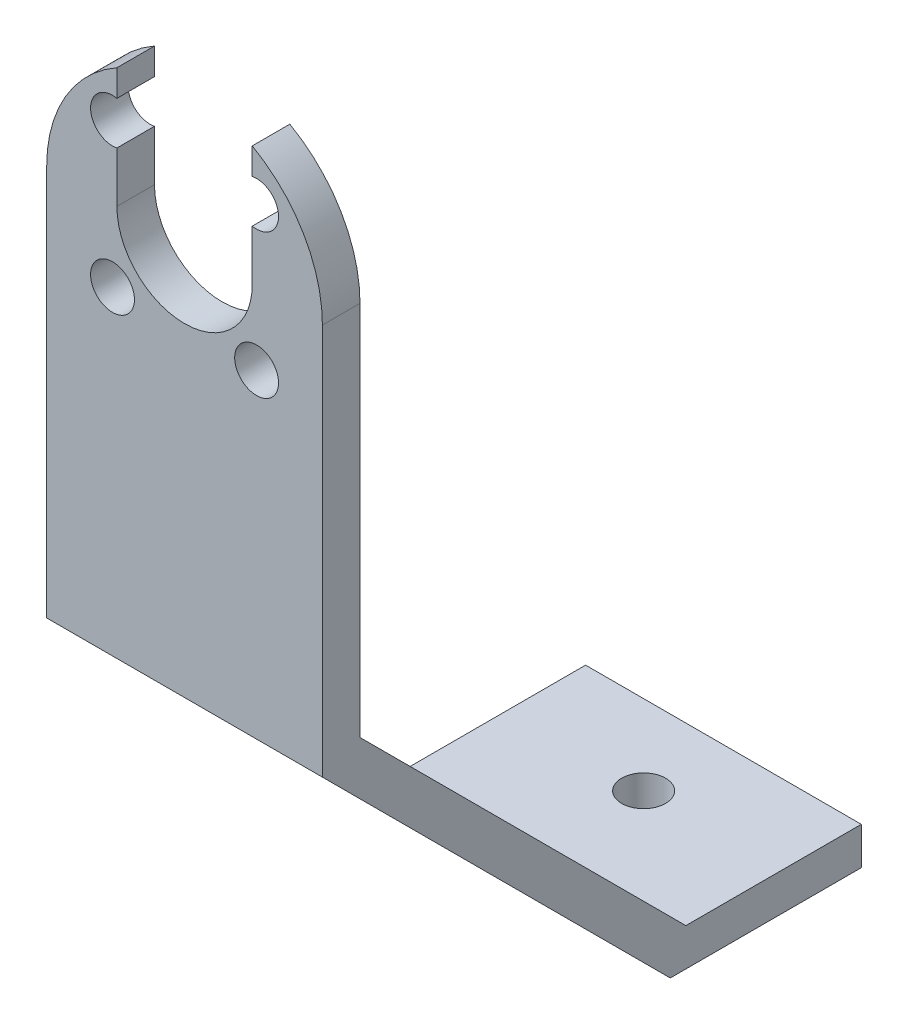
ISO-10303-21;
HEADER;
FILE_DESCRIPTION(('STEP AP214'),'2;1');
FILE_NAME('part.step','',(''),(''),'','','');
FILE_SCHEMA(('AUTOMOTIVE_DESIGN { 1 0 10303 214 1 1 1 1 }'));
ENDSEC;
DATA;
#1=APPLICATION_CONTEXT('core data for automotive mechanical design processes');
#2=APPLICATION_PROTOCOL_DEFINITION('international standard','automotive_design',2000,#1);
#3=PRODUCT_CONTEXT('',#1,'mechanical');
#4=PRODUCT('Part','Part','',(#3));
#5=PRODUCT_RELATED_PRODUCT_CATEGORY('part','',(#4));
#6=PRODUCT_DEFINITION_FORMATION('','',#4);
#7=PRODUCT_DEFINITION_CONTEXT('part definition',#1,'design');
#8=PRODUCT_DEFINITION('design','',#6,#7);
#9=PRODUCT_DEFINITION_SHAPE('','',#8);
#10=(LENGTH_UNIT() NAMED_UNIT(*) SI_UNIT(.MILLI.,.METRE.));
#11=(NAMED_UNIT(*) PLANE_ANGLE_UNIT() SI_UNIT($,.RADIAN.));
#12=(NAMED_UNIT(*) SI_UNIT($,.STERADIAN.) SOLID_ANGLE_UNIT());
#13=UNCERTAINTY_MEASURE_WITH_UNIT(LENGTH_MEASURE(1.E-05),#10,'distance_accuracy_value','');
#14=(GEOMETRIC_REPRESENTATION_CONTEXT(3) GLOBAL_UNCERTAINTY_ASSIGNED_CONTEXT((#13)) GLOBAL_UNIT_ASSIGNED_CONTEXT((#10,
#11,#12)) REPRESENTATION_CONTEXT('',''));
#15=CARTESIAN_POINT('',(0.,0.,0.));
#16=DIRECTION('',(0.,0.,1.));
#17=DIRECTION('',(1.,0.,0.));
#18=AXIS2_PLACEMENT_3D('',#15,#16,#17);
#19=CARTESIAN_POINT('',(0.,0.,0.));
#20=DIRECTION('',(0.,0.,1.));
#21=DIRECTION('',(1.,0.,0.));
#22=AXIS2_PLACEMENT_3D('',#19,#20,#21);
#23=PLANE('',#22);
#24=CARTESIAN_POINT('',(-5.75000000000002,-5.74999999999991,0.));
#25=DIRECTION('',(0.,0.,1.));
#26=DIRECTION('',(1.,0.,0.));
#27=AXIS2_PLACEMENT_3D('',#24,#25,#26);
#28=CIRCLE('',#27,1.75);
#29=CARTESIAN_POINT('',(-4.00000000000002,-5.74999999999991,0.));
#30=VERTEX_POINT('',#29);
#31=EDGE_CURVE('E229',#30,#30,#28,.T.);
#32=ORIENTED_EDGE('',*,*,#31,.T.);
#33=EDGE_LOOP('',(#32));
#34=FACE_BOUND('',#33,.T.);
#35=CARTESIAN_POINT('',(5.74999999999998,-5.74999999999996,0.));
#36=DIRECTION('',(0.,0.,1.));
#37=DIRECTION('',(1.,0.,0.));
#38=AXIS2_PLACEMENT_3D('',#35,#36,#37);
#39=CIRCLE('',#38,1.75);
#40=CARTESIAN_POINT('',(7.49999999999998,-5.74999999999996,0.));
#41=VERTEX_POINT('',#40);
#42=EDGE_CURVE('E187',#41,#41,#39,.T.);
#43=ORIENTED_EDGE('',*,*,#42,.T.);
#44=EDGE_LOOP('',(#43));
#45=FACE_BOUND('',#44,.T.);
#46=DIRECTION('',(0.,1.,0.));
#47=VECTOR('',#46,1.);
#48=CARTESIAN_POINT('',(11.,-58.9999999999999,0.));
#49=LINE('',#48,#47);
#50=CARTESIAN_POINT('',(11.,-30.,0.));
#51=VERTEX_POINT('',#50);
#52=CARTESIAN_POINT('',(11.,0.,0.));
#53=VERTEX_POINT('',#52);
#54=EDGE_CURVE('E173',#51,#53,#49,.T.);
#55=ORIENTED_EDGE('',*,*,#54,.F.);
#56=DIRECTION('',(1.,0.,0.));
#57=VECTOR('',#56,1.);
#58=CARTESIAN_POINT('',(-11.,-30.,0.));
#59=LINE('',#58,#57);
#60=CARTESIAN_POINT('',(-11.,-30.,0.));
#61=VERTEX_POINT('',#60);
#62=EDGE_CURVE('E291',#61,#51,#59,.T.);
#63=ORIENTED_EDGE('',*,*,#62,.F.);
#64=DIRECTION('',(0.,1.,0.));
#65=VECTOR('',#64,1.);
#66=CARTESIAN_POINT('',(-11.,-58.9999999999999,0.));
#67=LINE('',#66,#65);
#68=CARTESIAN_POINT('',(-11.,0.,0.));
#69=VERTEX_POINT('',#68);
#70=EDGE_CURVE('E180',#61,#69,#67,.T.);
#71=ORIENTED_EDGE('',*,*,#70,.T.);
#72=CARTESIAN_POINT('',(0.,0.,0.));
#73=DIRECTION('',(0.,0.,1.));
#74=DIRECTION('',(1.,0.,0.));
#75=AXIS2_PLACEMENT_3D('',#72,#73,#74);
#76=CIRCLE('',#75,11.);
#77=CARTESIAN_POINT('',(-5.4,9.58331884056875,0.));
#78=VERTEX_POINT('',#77);
#79=EDGE_CURVE('E225',#78,#69,#76,.T.);
#80=ORIENTED_EDGE('',*,*,#79,.F.);
#81=DIRECTION('',(0.,1.,0.));
#82=VECTOR('',#81,1.);
#83=CARTESIAN_POINT('',(-5.4,0.,0.));
#84=LINE('',#83,#82);
#85=CARTESIAN_POINT('',(-5.4,7.46464281994815,0.));
#86=VERTEX_POINT('',#85);
#87=EDGE_CURVE('E222',#86,#78,#84,.T.);
#88=ORIENTED_EDGE('',*,*,#87,.F.);
#89=CARTESIAN_POINT('',(-5.74999999999991,5.74999999999991,0.));
#90=DIRECTION('',(0.,0.,1.));
#91=DIRECTION('',(1.,0.,0.));
#92=AXIS2_PLACEMENT_3D('',#89,#90,#91);
#93=CIRCLE('',#92,1.75);
#94=CARTESIAN_POINT('',(-5.4,4.03535718005167,0.));
#95=VERTEX_POINT('',#94);
#96=EDGE_CURVE('E221',#86,#95,#93,.T.);
#97=ORIENTED_EDGE('',*,*,#96,.T.);
#98=CARTESIAN_POINT('',(-5.4,0.,0.));
#99=VERTEX_POINT('',#98);
#100=EDGE_CURVE('E218',#99,#95,#84,.T.);
#101=ORIENTED_EDGE('',*,*,#100,.F.);
#102=CARTESIAN_POINT('',(0.,0.,0.));
#103=DIRECTION('',(0.,0.,1.));
#104=DIRECTION('',(1.,0.,0.));
#105=AXIS2_PLACEMENT_3D('',#102,#103,#104);
#106=CIRCLE('',#105,5.4);
#107=CARTESIAN_POINT('',(5.4,0.,0.));
#108=VERTEX_POINT('',#107);
#109=EDGE_CURVE('E214',#99,#108,#106,.T.);
#110=ORIENTED_EDGE('',*,*,#109,.T.);
#111=DIRECTION('',(0.,1.,0.));
#112=VECTOR('',#111,1.);
#113=CARTESIAN_POINT('',(5.4,0.,0.));
#114=LINE('',#113,#112);
#115=CARTESIAN_POINT('',(5.4,4.03535718005169,0.));
#116=VERTEX_POINT('',#115);
#117=EDGE_CURVE('E211',#108,#116,#114,.T.);
#118=ORIENTED_EDGE('',*,*,#117,.T.);
#119=CARTESIAN_POINT('',(5.75000000000002,5.74999999999991,0.));
#120=DIRECTION('',(0.,0.,1.));
#121=DIRECTION('',(1.,0.,0.));
#122=AXIS2_PLACEMENT_3D('',#119,#120,#121);
#123=CIRCLE('',#122,1.75);
#124=CARTESIAN_POINT('',(5.4,7.46464281994813,0.));
#125=VERTEX_POINT('',#124);
#126=EDGE_CURVE('E182',#116,#125,#123,.T.);
#127=ORIENTED_EDGE('',*,*,#126,.T.);
#128=CARTESIAN_POINT('',(5.4,9.58331884056875,0.));
#129=VERTEX_POINT('',#128);
#130=EDGE_CURVE('E215',#125,#129,#114,.T.);
#131=ORIENTED_EDGE('',*,*,#130,.T.);
#132=EDGE_CURVE('E228',#53,#129,#76,.T.);
#133=ORIENTED_EDGE('',*,*,#132,.F.);
#134=EDGE_LOOP('',(#55,#63,#71,#80,#88,#97,#101,#110,#118,#127,#131,#133));
#135=FACE_BOUND('',#134,.T.);
#136=ADVANCED_FACE('F35',(#34,#45,#135),#23,.F.);
#137=CARTESIAN_POINT('',(51.1123422402632,-55.9999999999999,0.));
#138=DIRECTION('',(0.,1.,0.));
#139=DIRECTION('',(0.,0.,1.));
#140=AXIS2_PLACEMENT_3D('',#137,#138,#139);
#141=PLANE('',#140);
#142=DIRECTION('',(1.,0.,0.));
#143=VECTOR('',#142,1.);
#144=CARTESIAN_POINT('',(-11.,-55.9999999999999,-26.));
#145=LINE('',#144,#143);
#146=CARTESIAN_POINT('',(-11.,-55.9999999999999,-26.));
#147=VERTEX_POINT('',#146);
#148=CARTESIAN_POINT('',(11.,-55.9999999999999,-26.));
#149=VERTEX_POINT('',#148);
#150=EDGE_CURVE('E317',#147,#149,#145,.T.);
#151=ORIENTED_EDGE('',*,*,#150,.T.);
#152=DIRECTION('',(0.,0.,1.));
#153=VECTOR('',#152,1.);
#154=CARTESIAN_POINT('',(11.,-55.9999999999999,0.));
#155=LINE('',#154,#153);
#156=CARTESIAN_POINT('',(11.,-55.9999999999999,-40.));
#157=VERTEX_POINT('',#156);
#158=EDGE_CURVE('E296',#157,#149,#155,.T.);
#159=ORIENTED_EDGE('',*,*,#158,.F.);
#160=DIRECTION('',(-1.,0.,0.));
#161=VECTOR('',#160,1.);
#162=CARTESIAN_POINT('',(51.1123422402632,-55.9999999999999,-40.));
#163=LINE('',#162,#161);
#164=CARTESIAN_POINT('',(-11.,-55.9999999999999,-40.));
#165=VERTEX_POINT('',#164);
#166=EDGE_CURVE('E301',#157,#165,#163,.T.);
#167=ORIENTED_EDGE('',*,*,#166,.T.);
#168=DIRECTION('',(0.,0.,-1.));
#169=VECTOR('',#168,1.);
#170=CARTESIAN_POINT('',(-11.,-55.9999999999999,0.));
#171=LINE('',#170,#169);
#172=EDGE_CURVE('E310',#147,#165,#171,.T.);
#173=ORIENTED_EDGE('',*,*,#172,.F.);
#174=EDGE_LOOP('',(#151,#159,#167,#173));
#175=FACE_BOUND('',#174,.T.);
#176=CARTESIAN_POINT('',(0.,-55.9999999999999,-33.63));
#177=DIRECTION('',(0.,1.,0.));
#178=DIRECTION('',(0.,0.,1.));
#179=AXIS2_PLACEMENT_3D('',#176,#177,#178);
#180=CIRCLE('',#179,1.75);
#181=CARTESIAN_POINT('',(0.,-55.9999999999999,-31.88));
#182=VERTEX_POINT('',#181);
#183=EDGE_CURVE('E39',#182,#182,#180,.T.);
#184=ORIENTED_EDGE('',*,*,#183,.F.);
#185=EDGE_LOOP('',(#184));
#186=FACE_BOUND('',#185,.T.);
#187=ADVANCED_FACE('F333',(#175,#186),#141,.T.);
#188=CARTESIAN_POINT('',(0.,0.,3.));
#189=DIRECTION('',(0.,0.,-1.));
#190=DIRECTION('',(-1.,0.,0.));
#191=AXIS2_PLACEMENT_3D('',#188,#189,#190);
#192=CYLINDRICAL_SURFACE('',#191,11.);
#193=DIRECTION('',(0.,0.,-1.));
#194=VECTOR('',#193,1.);
#195=CARTESIAN_POINT('',(-11.,0.,3.));
#196=LINE('',#195,#194);
#197=CARTESIAN_POINT('',(-11.,0.,3.));
#198=VERTEX_POINT('',#197);
#199=EDGE_CURVE('E294',#69,#198,#196,.F.);
#200=ORIENTED_EDGE('',*,*,#199,.T.);
#201=CARTESIAN_POINT('',(0.,0.,3.));
#202=DIRECTION('',(0.,0.,1.));
#203=DIRECTION('',(1.,0.,0.));
#204=AXIS2_PLACEMENT_3D('',#201,#202,#203);
#205=CIRCLE('',#204,11.);
#206=CARTESIAN_POINT('',(-5.4,9.58331884056875,3.));
#207=VERTEX_POINT('',#206);
#208=EDGE_CURVE('E169',#207,#198,#205,.T.);
#209=ORIENTED_EDGE('',*,*,#208,.F.);
#210=DIRECTION('',(0.,0.,-1.));
#211=VECTOR('',#210,1.);
#212=CARTESIAN_POINT('',(-5.4,9.58331884056875,3.));
#213=LINE('',#212,#211);
#214=EDGE_CURVE('E238',#207,#78,#213,.T.);
#215=ORIENTED_EDGE('',*,*,#214,.T.);
#216=ORIENTED_EDGE('',*,*,#79,.T.);
#217=EDGE_LOOP('',(#200,#209,#215,#216));
#218=FACE_BOUND('',#217,.T.);
#219=ADVANCED_FACE('F288',(#218),#192,.T.);
#220=CARTESIAN_POINT('',(11.,0.,3.));
#221=VERTEX_POINT('',#220);
#222=CARTESIAN_POINT('',(5.4,9.58331884056875,3.));
#223=VERTEX_POINT('',#222);
#224=EDGE_CURVE('E201',#221,#223,#205,.T.);
#225=ORIENTED_EDGE('',*,*,#224,.F.);
#226=DIRECTION('',(0.,0.,-1.));
#227=VECTOR('',#226,1.);
#228=CARTESIAN_POINT('',(11.,0.,3.));
#229=LINE('',#228,#227);
#230=EDGE_CURVE('E281',#53,#221,#229,.F.);
#231=ORIENTED_EDGE('',*,*,#230,.F.);
#232=ORIENTED_EDGE('',*,*,#132,.T.);
#233=DIRECTION('',(0.,0.,-1.));
#234=VECTOR('',#233,1.);
#235=CARTESIAN_POINT('',(5.4,9.58331884056875,3.));
#236=LINE('',#235,#234);
#237=EDGE_CURVE('E235',#223,#129,#236,.T.);
#238=ORIENTED_EDGE('',*,*,#237,.F.);
#239=EDGE_LOOP('',(#225,#231,#232,#238));
#240=FACE_BOUND('',#239,.T.);
#241=ADVANCED_FACE('F278',(#240),#192,.T.);
#242=CARTESIAN_POINT('',(5.75000000000002,5.74999999999991,3.));
#243=DIRECTION('',(0.,0.,-1.));
#244=DIRECTION('',(-1.,0.,0.));
#245=AXIS2_PLACEMENT_3D('',#242,#243,#244);
#246=CYLINDRICAL_SURFACE('',#245,1.75);
#247=ORIENTED_EDGE('',*,*,#126,.F.);
#248=DIRECTION('',(0.,0.,-1.));
#249=VECTOR('',#248,1.);
#250=CARTESIAN_POINT('',(5.4,4.03535718005169,3.));
#251=LINE('',#250,#249);
#252=CARTESIAN_POINT('',(5.4,4.03535718005169,3.));
#253=VERTEX_POINT('',#252);
#254=EDGE_CURVE('E11',#253,#116,#251,.T.);
#255=ORIENTED_EDGE('',*,*,#254,.F.);
#256=CARTESIAN_POINT('',(5.75000000000002,5.74999999999991,3.));
#257=DIRECTION('',(0.,0.,1.));
#258=DIRECTION('',(1.,0.,0.));
#259=AXIS2_PLACEMENT_3D('',#256,#257,#258);
#260=CIRCLE('',#259,1.75);
#261=CARTESIAN_POINT('',(5.4,7.46464281994813,3.));
#262=VERTEX_POINT('',#261);
#263=EDGE_CURVE('E183',#253,#262,#260,.T.);
#264=ORIENTED_EDGE('',*,*,#263,.T.);
#265=DIRECTION('',(0.,0.,-1.));
#266=VECTOR('',#265,1.);
#267=CARTESIAN_POINT('',(5.4,7.46464281994813,3.));
#268=LINE('',#267,#266);
#269=EDGE_CURVE('E208',#262,#125,#268,.T.);
#270=ORIENTED_EDGE('',*,*,#269,.T.);
#271=EDGE_LOOP('',(#247,#255,#264,#270));
#272=FACE_BOUND('',#271,.T.);
#273=ADVANCED_FACE('F37',(#272),#246,.F.);
#274=CARTESIAN_POINT('',(5.4,0.,3.));
#275=DIRECTION('',(-1.,0.,0.));
#276=DIRECTION('',(0.,0.,1.));
#277=AXIS2_PLACEMENT_3D('',#274,#275,#276);
#278=PLANE('',#277);
#279=ORIENTED_EDGE('',*,*,#117,.F.);
#280=DIRECTION('',(0.,0.,-1.));
#281=VECTOR('',#280,1.);
#282=CARTESIAN_POINT('',(5.4,0.,3.));
#283=LINE('',#282,#281);
#284=CARTESIAN_POINT('',(5.4,0.,3.));
#285=VERTEX_POINT('',#284);
#286=EDGE_CURVE('E44',#285,#108,#283,.T.);
#287=ORIENTED_EDGE('',*,*,#286,.F.);
#288=DIRECTION('',(0.,1.,0.));
#289=VECTOR('',#288,1.);
#290=CARTESIAN_POINT('',(5.4,0.,3.));
#291=LINE('',#290,#289);
#292=EDGE_CURVE('E186',#285,#253,#291,.T.);
#293=ORIENTED_EDGE('',*,*,#292,.T.);
#294=ORIENTED_EDGE('',*,*,#254,.T.);
#295=EDGE_LOOP('',(#279,#287,#293,#294));
#296=FACE_BOUND('',#295,.T.);
#297=ADVANCED_FACE('F254',(#296),#278,.T.);
#298=CARTESIAN_POINT('',(0.,0.,3.));
#299=DIRECTION('',(0.,0.,-1.));
#300=DIRECTION('',(-1.,0.,0.));
#301=AXIS2_PLACEMENT_3D('',#298,#299,#300);
#302=CYLINDRICAL_SURFACE('',#301,5.4);
#303=ORIENTED_EDGE('',*,*,#109,.F.);
#304=DIRECTION('',(0.,0.,-1.));
#305=VECTOR('',#304,1.);
#306=CARTESIAN_POINT('',(-5.4,0.,3.));
#307=LINE('',#306,#305);
#308=CARTESIAN_POINT('',(-5.4,0.,3.));
#309=VERTEX_POINT('',#308);
#310=EDGE_CURVE('E245',#309,#99,#307,.T.);
#311=ORIENTED_EDGE('',*,*,#310,.F.);
#312=CARTESIAN_POINT('',(0.,0.,3.));
#313=DIRECTION('',(0.,0.,1.));
#314=DIRECTION('',(1.,0.,0.));
#315=AXIS2_PLACEMENT_3D('',#312,#313,#314);
#316=CIRCLE('',#315,5.4);
#317=EDGE_CURVE('E190',#309,#285,#316,.T.);
#318=ORIENTED_EDGE('',*,*,#317,.T.);
#319=ORIENTED_EDGE('',*,*,#286,.T.);
#320=EDGE_LOOP('',(#303,#311,#318,#319));
#321=FACE_BOUND('',#320,.T.);
#322=ADVANCED_FACE('F250',(#321),#302,.F.);
#323=CARTESIAN_POINT('',(-5.4,0.,3.));
#324=DIRECTION('',(-1.,0.,0.));
#325=DIRECTION('',(0.,0.,1.));
#326=AXIS2_PLACEMENT_3D('',#323,#324,#325);
#327=PLANE('',#326);
#328=ORIENTED_EDGE('',*,*,#100,.T.);
#329=DIRECTION('',(0.,0.,-1.));
#330=VECTOR('',#329,1.);
#331=CARTESIAN_POINT('',(-5.4,4.03535718005167,3.));
#332=LINE('',#331,#330);
#333=CARTESIAN_POINT('',(-5.4,4.03535718005167,3.));
#334=VERTEX_POINT('',#333);
#335=EDGE_CURVE('E243',#334,#95,#332,.T.);
#336=ORIENTED_EDGE('',*,*,#335,.F.);
#337=DIRECTION('',(0.,1.,0.));
#338=VECTOR('',#337,1.);
#339=CARTESIAN_POINT('',(-5.4,0.,3.));
#340=LINE('',#339,#338);
#341=EDGE_CURVE('E194',#309,#334,#340,.T.);
#342=ORIENTED_EDGE('',*,*,#341,.F.);
#343=ORIENTED_EDGE('',*,*,#310,.T.);
#344=EDGE_LOOP('',(#328,#336,#342,#343));
#345=FACE_BOUND('',#344,.T.);
#346=ADVANCED_FACE('F263',(#345),#327,.F.);
#347=CARTESIAN_POINT('',(-5.74999999999991,5.74999999999991,3.));
#348=DIRECTION('',(0.,0.,-1.));
#349=DIRECTION('',(-1.,0.,0.));
#350=AXIS2_PLACEMENT_3D('',#347,#348,#349);
#351=CYLINDRICAL_SURFACE('',#350,1.75);
#352=ORIENTED_EDGE('',*,*,#96,.F.);
#353=DIRECTION('',(0.,0.,-1.));
#354=VECTOR('',#353,1.);
#355=CARTESIAN_POINT('',(-5.4,7.46464281994815,3.));
#356=LINE('',#355,#354);
#357=CARTESIAN_POINT('',(-5.4,7.46464281994815,3.));
#358=VERTEX_POINT('',#357);
#359=EDGE_CURVE('E241',#358,#86,#356,.T.);
#360=ORIENTED_EDGE('',*,*,#359,.F.);
#361=CARTESIAN_POINT('',(-5.74999999999991,5.74999999999991,3.));
#362=DIRECTION('',(0.,0.,1.));
#363=DIRECTION('',(1.,0.,0.));
#364=AXIS2_PLACEMENT_3D('',#361,#362,#363);
#365=CIRCLE('',#364,1.75);
#366=EDGE_CURVE('E196',#358,#334,#365,.T.);
#367=ORIENTED_EDGE('',*,*,#366,.T.);
#368=ORIENTED_EDGE('',*,*,#335,.T.);
#369=EDGE_LOOP('',(#352,#360,#367,#368));
#370=FACE_BOUND('',#369,.T.);
#371=ADVANCED_FACE('F338',(#370),#351,.F.);
#372=ORIENTED_EDGE('',*,*,#87,.T.);
#373=ORIENTED_EDGE('',*,*,#214,.F.);
#374=EDGE_CURVE('E197',#358,#207,#340,.T.);
#375=ORIENTED_EDGE('',*,*,#374,.F.);
#376=ORIENTED_EDGE('',*,*,#359,.T.);
#377=EDGE_LOOP('',(#372,#373,#375,#376));
#378=FACE_BOUND('',#377,.T.);
#379=ADVANCED_FACE('F284',(#378),#327,.F.);
#380=CARTESIAN_POINT('',(-5.75000000000002,-5.74999999999991,3.));
#381=DIRECTION('',(0.,0.,-1.));
#382=DIRECTION('',(-1.,0.,0.));
#383=AXIS2_PLACEMENT_3D('',#380,#381,#382);
#384=CYLINDRICAL_SURFACE('',#383,1.75);
#385=CARTESIAN_POINT('',(-5.75000000000002,-5.74999999999991,3.));
#386=DIRECTION('',(0.,0.,1.));
#387=DIRECTION('',(1.,0.,0.));
#388=AXIS2_PLACEMENT_3D('',#385,#386,#387);
#389=CIRCLE('',#388,1.75);
#390=CARTESIAN_POINT('',(-4.00000000000002,-5.74999999999991,3.));
#391=VERTEX_POINT('',#390);
#392=EDGE_CURVE('E202',#391,#391,#389,.T.);
#393=ORIENTED_EDGE('',*,*,#392,.T.);
#394=EDGE_LOOP('',(#393));
#395=FACE_BOUND('',#394,.T.);
#396=ORIENTED_EDGE('',*,*,#31,.F.);
#397=EDGE_LOOP('',(#396));
#398=FACE_BOUND('',#397,.T.);
#399=ADVANCED_FACE('F345',(#395,#398),#384,.F.);
#400=ORIENTED_EDGE('',*,*,#130,.F.);
#401=ORIENTED_EDGE('',*,*,#269,.F.);
#402=EDGE_CURVE('E191',#262,#223,#291,.T.);
#403=ORIENTED_EDGE('',*,*,#402,.T.);
#404=ORIENTED_EDGE('',*,*,#237,.T.);
#405=EDGE_LOOP('',(#400,#401,#403,#404));
#406=FACE_BOUND('',#405,.T.);
#407=ADVANCED_FACE('F274',(#406),#278,.T.);
#408=CARTESIAN_POINT('',(5.74999999999998,-5.74999999999996,3.));
#409=DIRECTION('',(0.,0.,-1.));
#410=DIRECTION('',(-1.,0.,0.));
#411=AXIS2_PLACEMENT_3D('',#408,#409,#410);
#412=CYLINDRICAL_SURFACE('',#411,1.75);
#413=CARTESIAN_POINT('',(5.74999999999998,-5.74999999999996,3.));
#414=DIRECTION('',(0.,0.,1.));
#415=DIRECTION('',(1.,0.,0.));
#416=AXIS2_PLACEMENT_3D('',#413,#414,#415);
#417=CIRCLE('',#416,1.75);
#418=CARTESIAN_POINT('',(7.49999999999998,-5.74999999999996,3.));
#419=VERTEX_POINT('',#418);
#420=EDGE_CURVE('E205',#419,#419,#417,.T.);
#421=ORIENTED_EDGE('',*,*,#420,.T.);
#422=EDGE_LOOP('',(#421));
#423=FACE_BOUND('',#422,.T.);
#424=ORIENTED_EDGE('',*,*,#42,.F.);
#425=EDGE_LOOP('',(#424));
#426=FACE_BOUND('',#425,.T.);
#427=ADVANCED_FACE('F358',(#423,#426),#412,.F.);
#428=CARTESIAN_POINT('',(0.,0.,3.));
#429=DIRECTION('',(0.,0.,1.));
#430=DIRECTION('',(1.,0.,0.));
#431=AXIS2_PLACEMENT_3D('',#428,#429,#430);
#432=PLANE('',#431);
#433=DIRECTION('',(1.,0.,0.));
#434=VECTOR('',#433,1.);
#435=CARTESIAN_POINT('',(-11.,-31.2426406871193,3.));
#436=LINE('',#435,#434);
#437=CARTESIAN_POINT('',(-11.,-31.2426406871193,3.));
#438=VERTEX_POINT('',#437);
#439=CARTESIAN_POINT('',(11.,-31.2426406871193,3.));
#440=VERTEX_POINT('',#439);
#441=EDGE_CURVE('E158',#438,#440,#436,.T.);
#442=ORIENTED_EDGE('',*,*,#441,.T.);
#443=DIRECTION('',(0.,1.,0.));
#444=VECTOR('',#443,1.);
#445=CARTESIAN_POINT('',(11.,-58.9999999999999,3.));
#446=LINE('',#445,#444);
#447=EDGE_CURVE('E170',#440,#221,#446,.T.);
#448=ORIENTED_EDGE('',*,*,#447,.T.);
#449=ORIENTED_EDGE('',*,*,#224,.T.);
#450=ORIENTED_EDGE('',*,*,#402,.F.);
#451=ORIENTED_EDGE('',*,*,#263,.F.);
#452=ORIENTED_EDGE('',*,*,#292,.F.);
#453=ORIENTED_EDGE('',*,*,#317,.F.);
#454=ORIENTED_EDGE('',*,*,#341,.T.);
#455=ORIENTED_EDGE('',*,*,#366,.F.);
#456=ORIENTED_EDGE('',*,*,#374,.T.);
#457=ORIENTED_EDGE('',*,*,#208,.T.);
#458=DIRECTION('',(0.,1.,0.));
#459=VECTOR('',#458,1.);
#460=CARTESIAN_POINT('',(-11.,-58.9999999999999,3.));
#461=LINE('',#460,#459);
#462=EDGE_CURVE('E151',#438,#198,#461,.T.);
#463=ORIENTED_EDGE('',*,*,#462,.F.);
#464=EDGE_LOOP('',(#442,#448,#449,#450,#451,#452,#453,#454,#455,#456,#457,#463));
#465=FACE_BOUND('',#464,.T.);
#466=ORIENTED_EDGE('',*,*,#392,.F.);
#467=EDGE_LOOP('',(#466));
#468=FACE_BOUND('',#467,.T.);
#469=ORIENTED_EDGE('',*,*,#420,.F.);
#470=EDGE_LOOP('',(#469));
#471=FACE_BOUND('',#470,.T.);
#472=ADVANCED_FACE('F166',(#465,#468,#471),#432,.T.);
#473=CARTESIAN_POINT('',(-11.,-58.9999999999999,3.));
#474=DIRECTION('',(1.,0.,0.));
#475=DIRECTION('',(0.,1.,0.));
#476=AXIS2_PLACEMENT_3D('',#473,#474,#475);
#477=PLANE('',#476);
#478=DIRECTION('',(0.,0.,-1.));
#479=VECTOR('',#478,1.);
#480=CARTESIAN_POINT('',(-11.,-58.9999999999999,3.));
#481=LINE('',#480,#479);
#482=CARTESIAN_POINT('',(-11.,-58.9999999999999,-24.7573593128808));
#483=VERTEX_POINT('',#482);
#484=CARTESIAN_POINT('',(-11.,-59.,-40.));
#485=VERTEX_POINT('',#484);
#486=EDGE_CURVE('E154',#483,#485,#481,.T.);
#487=ORIENTED_EDGE('',*,*,#486,.F.);
#488=DIRECTION('',(0.,-0.707106781186546,-0.707106781186549));
#489=VECTOR('',#488,1.);
#490=CARTESIAN_POINT('',(-11.,-55.9999999999999,-21.7573593128808));
#491=LINE('',#490,#489);
#492=EDGE_CURVE('E51',#438,#483,#491,.T.);
#493=ORIENTED_EDGE('',*,*,#492,.F.);
#494=ORIENTED_EDGE('',*,*,#462,.T.);
#495=ORIENTED_EDGE('',*,*,#199,.F.);
#496=ORIENTED_EDGE('',*,*,#70,.F.);
#497=DIRECTION('',(0.,0.707106781186546,0.707106781186549));
#498=VECTOR('',#497,1.);
#499=CARTESIAN_POINT('',(-11.,-30.,0.));
#500=LINE('',#499,#498);
#501=EDGE_CURVE('E155',#147,#61,#500,.T.);
#502=ORIENTED_EDGE('',*,*,#501,.F.);
#503=ORIENTED_EDGE('',*,*,#172,.T.);
#504=DIRECTION('',(0.,1.,0.));
#505=VECTOR('',#504,1.);
#506=CARTESIAN_POINT('',(-11.,-59.,-40.));
#507=LINE('',#506,#505);
#508=EDGE_CURVE('E305',#485,#165,#507,.T.);
#509=ORIENTED_EDGE('',*,*,#508,.F.);
#510=EDGE_LOOP('',(#487,#493,#494,#495,#496,#502,#503,#509));
#511=FACE_BOUND('',#510,.T.);
#512=ADVANCED_FACE('F148',(#511),#477,.F.);
#513=CARTESIAN_POINT('',(11.,-58.9999999999999,3.));
#514=DIRECTION('',(-1.,0.,0.));
#515=DIRECTION('',(0.,-1.,0.));
#516=AXIS2_PLACEMENT_3D('',#513,#514,#515);
#517=PLANE('',#516);
#518=ORIENTED_EDGE('',*,*,#447,.F.);
#519=DIRECTION('',(0.,-0.707106781186546,-0.707106781186549));
#520=VECTOR('',#519,1.);
#521=CARTESIAN_POINT('',(11.,-55.9999999999999,-21.7573593128808));
#522=LINE('',#521,#520);
#523=CARTESIAN_POINT('',(11.,-59.,-24.7573593128808));
#524=VERTEX_POINT('',#523);
#525=EDGE_CURVE('E160',#440,#524,#522,.T.);
#526=ORIENTED_EDGE('',*,*,#525,.T.);
#527=DIRECTION('',(0.,0.,1.));
#528=VECTOR('',#527,1.);
#529=CARTESIAN_POINT('',(11.,-58.9999999999999,3.));
#530=LINE('',#529,#528);
#531=CARTESIAN_POINT('',(11.,-59.,-40.));
#532=VERTEX_POINT('',#531);
#533=EDGE_CURVE('E171',#532,#524,#530,.T.);
#534=ORIENTED_EDGE('',*,*,#533,.F.);
#535=DIRECTION('',(0.,-1.,0.));
#536=VECTOR('',#535,1.);
#537=CARTESIAN_POINT('',(11.,-59.,-40.));
#538=LINE('',#537,#536);
#539=EDGE_CURVE('E300',#157,#532,#538,.T.);
#540=ORIENTED_EDGE('',*,*,#539,.F.);
#541=ORIENTED_EDGE('',*,*,#158,.T.);
#542=DIRECTION('',(0.,0.707106781186546,0.707106781186549));
#543=VECTOR('',#542,1.);
#544=CARTESIAN_POINT('',(11.,-30.,0.));
#545=LINE('',#544,#543);
#546=EDGE_CURVE('E59',#149,#51,#545,.T.);
#547=ORIENTED_EDGE('',*,*,#546,.T.);
#548=ORIENTED_EDGE('',*,*,#54,.T.);
#549=ORIENTED_EDGE('',*,*,#230,.T.);
#550=EDGE_LOOP('',(#518,#526,#534,#540,#541,#547,#548,#549));
#551=FACE_BOUND('',#550,.T.);
#552=ADVANCED_FACE('F327',(#551),#517,.F.);
#553=CARTESIAN_POINT('',(0.,-58.9999999999999,0.));
#554=DIRECTION('',(0.,1.,0.));
#555=DIRECTION('',(0.,0.,1.));
#556=AXIS2_PLACEMENT_3D('',#553,#554,#555);
#557=PLANE('',#556);
#558=CARTESIAN_POINT('',(0.,-58.9999999999999,-33.63));
#559=DIRECTION('',(0.,-1.,0.));
#560=DIRECTION('',(0.,0.,-1.));
#561=AXIS2_PLACEMENT_3D('',#558,#559,#560);
#562=CIRCLE('',#561,1.75);
#563=CARTESIAN_POINT('',(0.,-58.9999999999999,-35.38));
#564=VERTEX_POINT('',#563);
#565=EDGE_CURVE('E314',#564,#564,#562,.T.);
#566=ORIENTED_EDGE('',*,*,#565,.F.);
#567=EDGE_LOOP('',(#566));
#568=FACE_BOUND('',#567,.T.);
#569=ORIENTED_EDGE('',*,*,#533,.T.);
#570=DIRECTION('',(1.,0.,0.));
#571=VECTOR('',#570,1.);
#572=CARTESIAN_POINT('',(-11.,-59.,-24.7573593128808));
#573=LINE('',#572,#571);
#574=EDGE_CURVE('E163',#483,#524,#573,.T.);
#575=ORIENTED_EDGE('',*,*,#574,.F.);
#576=ORIENTED_EDGE('',*,*,#486,.T.);
#577=DIRECTION('',(-1.,0.,0.));
#578=VECTOR('',#577,1.);
#579=CARTESIAN_POINT('',(51.1123422402632,-59.,-40.));
#580=LINE('',#579,#578);
#581=EDGE_CURVE('E304',#532,#485,#580,.T.);
#582=ORIENTED_EDGE('',*,*,#581,.F.);
#583=EDGE_LOOP('',(#569,#575,#576,#582));
#584=FACE_BOUND('',#583,.T.);
#585=ADVANCED_FACE('F326',(#568,#584),#557,.F.);
#586=CARTESIAN_POINT('',(51.1123422402632,-59.,-40.));
#587=DIRECTION('',(0.,0.,1.));
#588=DIRECTION('',(1.,0.,0.));
#589=AXIS2_PLACEMENT_3D('',#586,#587,#588);
#590=PLANE('',#589);
#591=ORIENTED_EDGE('',*,*,#166,.F.);
#592=ORIENTED_EDGE('',*,*,#539,.T.);
#593=ORIENTED_EDGE('',*,*,#581,.T.);
#594=ORIENTED_EDGE('',*,*,#508,.T.);
#595=EDGE_LOOP('',(#591,#592,#593,#594));
#596=FACE_BOUND('',#595,.T.);
#597=ADVANCED_FACE('F330',(#596),#590,.F.);
#598=CARTESIAN_POINT('',(0.,-48.9999999999999,-33.63));
#599=DIRECTION('',(0.,-1.,0.));
#600=DIRECTION('',(0.,0.,-1.));
#601=AXIS2_PLACEMENT_3D('',#598,#599,#600);
#602=CYLINDRICAL_SURFACE('',#601,1.75);
#603=ORIENTED_EDGE('',*,*,#183,.T.);
#604=EDGE_LOOP('',(#603));
#605=FACE_BOUND('',#604,.T.);
#606=ORIENTED_EDGE('',*,*,#565,.T.);
#607=EDGE_LOOP('',(#606));
#608=FACE_BOUND('',#607,.T.);
#609=ADVANCED_FACE('F434',(#605,#608),#602,.F.);
#610=CARTESIAN_POINT('',(-11.,-30.,0.));
#611=DIRECTION('',(0.,0.707106781186549,-0.707106781186546));
#612=DIRECTION('',(0.,0.707106781186546,0.707106781186549));
#613=AXIS2_PLACEMENT_3D('',#610,#611,#612);
#614=PLANE('',#613);
#615=ORIENTED_EDGE('',*,*,#546,.F.);
#616=ORIENTED_EDGE('',*,*,#150,.F.);
#617=ORIENTED_EDGE('',*,*,#501,.T.);
#618=ORIENTED_EDGE('',*,*,#62,.T.);
#619=EDGE_LOOP('',(#615,#616,#617,#618));
#620=FACE_BOUND('',#619,.T.);
#621=ADVANCED_FACE('F336',(#620),#614,.T.);
#622=CARTESIAN_POINT('',(-11.,-55.9999999999999,-21.7573593128808));
#623=DIRECTION('',(0.,-0.707106781186549,0.707106781186546));
#624=DIRECTION('',(0.,-0.707106781186546,-0.707106781186549));
#625=AXIS2_PLACEMENT_3D('',#622,#623,#624);
#626=PLANE('',#625);
#627=ORIENTED_EDGE('',*,*,#525,.F.);
#628=ORIENTED_EDGE('',*,*,#441,.F.);
#629=ORIENTED_EDGE('',*,*,#492,.T.);
#630=ORIENTED_EDGE('',*,*,#574,.T.);
#631=EDGE_LOOP('',(#627,#628,#629,#630));
#632=FACE_BOUND('',#631,.T.);
#633=ADVANCED_FACE('F159',(#632),#626,.T.);
#634=CLOSED_SHELL('',(#136,#187,#219,#241,#273,#297,#322,#346,#371,#379,#399,#407,#427,#472,
#512,#552,#585,#597,#609,#621,#633));
#635=MANIFOLD_SOLID_BREP('B2',#634);
#636=ADVANCED_BREP_SHAPE_REPRESENTATION('',(#18,#635),#14);
#637=SHAPE_DEFINITION_REPRESENTATION(#9,#636);
ENDSEC;
END-ISO-10303-21;
